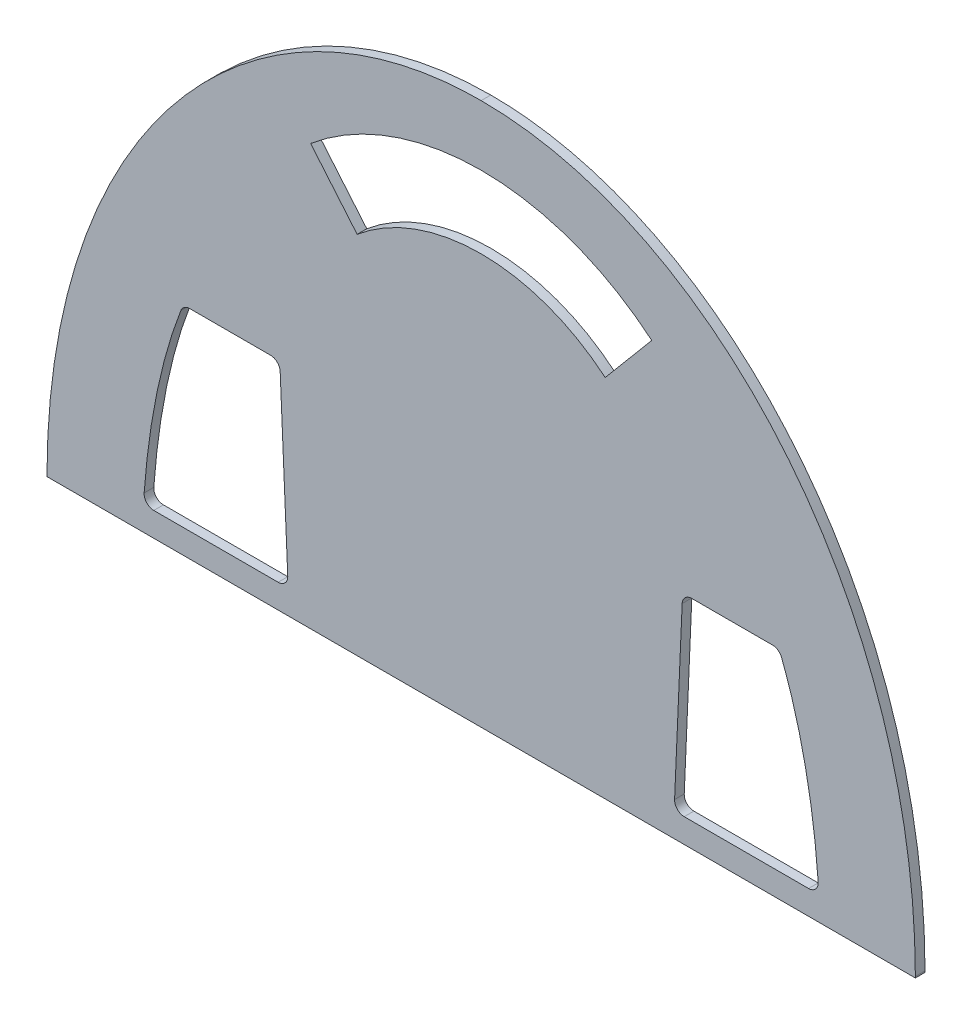
ISO-10303-21;
HEADER;
FILE_DESCRIPTION(('STEP AP214'),'2;1');
FILE_NAME('part.step','',(''),(''),'','','');
FILE_SCHEMA(('AUTOMOTIVE_DESIGN { 1 0 10303 214 1 1 1 1 }'));
ENDSEC;
DATA;
#1=APPLICATION_CONTEXT('core data for automotive mechanical design processes');
#2=APPLICATION_PROTOCOL_DEFINITION('international standard','automotive_design',2000,#1);
#3=PRODUCT_CONTEXT('',#1,'mechanical');
#4=PRODUCT('Part','Part','',(#3));
#5=PRODUCT_RELATED_PRODUCT_CATEGORY('part','',(#4));
#6=PRODUCT_DEFINITION_FORMATION('','',#4);
#7=PRODUCT_DEFINITION_CONTEXT('part definition',#1,'design');
#8=PRODUCT_DEFINITION('design','',#6,#7);
#9=PRODUCT_DEFINITION_SHAPE('','',#8);
#10=(LENGTH_UNIT() NAMED_UNIT(*) SI_UNIT(.MILLI.,.METRE.));
#11=(NAMED_UNIT(*) PLANE_ANGLE_UNIT() SI_UNIT($,.RADIAN.));
#12=(NAMED_UNIT(*) SI_UNIT($,.STERADIAN.) SOLID_ANGLE_UNIT());
#13=UNCERTAINTY_MEASURE_WITH_UNIT(LENGTH_MEASURE(1.E-05),#10,'distance_accuracy_value','');
#14=(GEOMETRIC_REPRESENTATION_CONTEXT(3) GLOBAL_UNCERTAINTY_ASSIGNED_CONTEXT((#13)) GLOBAL_UNIT_ASSIGNED_CONTEXT((#10,
#11,#12)) REPRESENTATION_CONTEXT('',''));
#15=CARTESIAN_POINT('',(0.,0.,0.));
#16=DIRECTION('',(0.,0.,1.));
#17=DIRECTION('',(1.,0.,0.));
#18=AXIS2_PLACEMENT_3D('',#15,#16,#17);
#19=CARTESIAN_POINT('',(-90.0000463433357,0.,2.));
#20=DIRECTION('',(0.999999985815437,-0.000168431370329986,0.));
#21=DIRECTION('',(0.000168431370329986,0.999999985815437,0.));
#22=AXIS2_PLACEMENT_3D('',#19,#20,#21);
#23=PLANE('',#22);
#24=DIRECTION('',(-0.000168431370329986,-0.999999985815437,0.));
#25=VECTOR('',#24,1.);
#26=CARTESIAN_POINT('',(-90.0000463433357,0.,0.));
#27=LINE('',#26,#25);
#28=CARTESIAN_POINT('',(-89.9999999998834,0.275147387972544,0.));
#29=VERTEX_POINT('',#28);
#30=CARTESIAN_POINT('',(-90.0000463433357,0.,0.));
#31=VERTEX_POINT('',#30);
#32=EDGE_CURVE('E332',#29,#31,#27,.T.);
#33=ORIENTED_EDGE('',*,*,#32,.T.);
#34=DIRECTION('',(0.,0.,-1.));
#35=VECTOR('',#34,1.);
#36=CARTESIAN_POINT('',(-90.0000463433357,0.,2.));
#37=LINE('',#36,#35);
#38=CARTESIAN_POINT('',(-90.0000463433357,0.,2.));
#39=VERTEX_POINT('',#38);
#40=EDGE_CURVE('E378',#39,#31,#37,.T.);
#41=ORIENTED_EDGE('',*,*,#40,.F.);
#42=DIRECTION('',(-0.000168431370329986,-0.999999985815437,0.));
#43=VECTOR('',#42,1.);
#44=CARTESIAN_POINT('',(-90.0000463433357,0.,2.));
#45=LINE('',#44,#43);
#46=CARTESIAN_POINT('',(-89.9999999998834,0.275147387972544,2.));
#47=VERTEX_POINT('',#46);
#48=EDGE_CURVE('E262',#47,#39,#45,.T.);
#49=ORIENTED_EDGE('',*,*,#48,.F.);
#50=DIRECTION('',(0.,0.,-1.));
#51=VECTOR('',#50,1.);
#52=CARTESIAN_POINT('',(-89.9999999998834,0.275147387972544,2.));
#53=LINE('',#52,#51);
#54=EDGE_CURVE('E368',#47,#29,#53,.T.);
#55=ORIENTED_EDGE('',*,*,#54,.T.);
#56=EDGE_LOOP('',(#33,#41,#49,#55));
#57=FACE_BOUND('',#56,.T.);
#58=ADVANCED_FACE('F51',(#57),#23,.F.);
#59=CARTESIAN_POINT('',(-90.0000463433357,0.,2.));
#60=DIRECTION('',(0.,1.,0.));
#61=DIRECTION('',(0.,0.,1.));
#62=AXIS2_PLACEMENT_3D('',#59,#60,#61);
#63=PLANE('',#62);
#64=DIRECTION('',(1.,0.,0.));
#65=VECTOR('',#64,1.);
#66=CARTESIAN_POINT('',(-90.0000463433357,0.,0.));
#67=LINE('',#66,#65);
#68=CARTESIAN_POINT('',(90.0000463433359,0.,0.));
#69=VERTEX_POINT('',#68);
#70=EDGE_CURVE('E344',#31,#69,#67,.T.);
#71=ORIENTED_EDGE('',*,*,#70,.T.);
#72=DIRECTION('',(0.,0.,-1.));
#73=VECTOR('',#72,1.);
#74=CARTESIAN_POINT('',(90.0000463433359,0.,2.));
#75=LINE('',#74,#73);
#76=CARTESIAN_POINT('',(90.0000463433359,0.,2.));
#77=VERTEX_POINT('',#76);
#78=EDGE_CURVE('E372',#77,#69,#75,.T.);
#79=ORIENTED_EDGE('',*,*,#78,.F.);
#80=DIRECTION('',(1.,0.,0.));
#81=VECTOR('',#80,1.);
#82=CARTESIAN_POINT('',(-90.0000463433357,0.,2.));
#83=LINE('',#82,#81);
#84=EDGE_CURVE('E256',#39,#77,#83,.T.);
#85=ORIENTED_EDGE('',*,*,#84,.F.);
#86=ORIENTED_EDGE('',*,*,#40,.T.);
#87=EDGE_LOOP('',(#71,#79,#85,#86));
#88=FACE_BOUND('',#87,.T.);
#89=ADVANCED_FACE('F416',(#88),#63,.F.);
#90=CARTESIAN_POINT('',(90.,0.275147387983933,2.));
#91=DIRECTION('',(-0.999999985815508,-0.000168430947403332,0.));
#92=DIRECTION('',(0.000168430947403332,-0.999999985815508,0.));
#93=AXIS2_PLACEMENT_3D('',#90,#91,#92);
#94=PLANE('',#93);
#95=DIRECTION('',(-0.000168430947403332,0.999999985815508,0.));
#96=VECTOR('',#95,1.);
#97=CARTESIAN_POINT('',(90.,0.275147387983933,0.));
#98=LINE('',#97,#96);
#99=CARTESIAN_POINT('',(90.,0.275147387983933,0.));
#100=VERTEX_POINT('',#99);
#101=EDGE_CURVE('E312',#69,#100,#98,.T.);
#102=ORIENTED_EDGE('',*,*,#101,.T.);
#103=DIRECTION('',(0.,0.,-1.));
#104=VECTOR('',#103,1.);
#105=CARTESIAN_POINT('',(90.,0.275147387983933,2.));
#106=LINE('',#105,#104);
#107=CARTESIAN_POINT('',(90.,0.275147387983933,2.));
#108=VERTEX_POINT('',#107);
#109=EDGE_CURVE('E359',#108,#100,#106,.T.);
#110=ORIENTED_EDGE('',*,*,#109,.F.);
#111=DIRECTION('',(-0.000168430947403332,0.999999985815508,0.));
#112=VECTOR('',#111,1.);
#113=CARTESIAN_POINT('',(90.,0.275147387983933,2.));
#114=LINE('',#113,#112);
#115=EDGE_CURVE('E265',#77,#108,#114,.T.);
#116=ORIENTED_EDGE('',*,*,#115,.F.);
#117=ORIENTED_EDGE('',*,*,#78,.T.);
#118=EDGE_LOOP('',(#102,#110,#116,#117));
#119=FACE_BOUND('',#118,.T.);
#120=ADVANCED_FACE('F285',(#119),#94,.F.);
#121=CARTESIAN_POINT('',(89.9999999998834,0.275147387972544,2.));
#122=CARTESIAN_POINT('',(89.8826957907706,65.7230552472039,2.));
#123=CARTESIAN_POINT('',(47.9199818309303,112.500308160194,2.));
#124=CARTESIAN_POINT('',(0.,112.500308160194,2.));
#125=B_SPLINE_CURVE_WITH_KNOTS('',3,(#121,#122,#123,#124),.UNSPECIFIED.,.F.,.F.,(4,4),
(0.0013988367909159,1.),.UNSPECIFIED.);
#126=DIRECTION('',(0.,0.,-1.));
#127=VECTOR('',#126,1.);
#128=SURFACE_OF_LINEAR_EXTRUSION('',#125,#127);
#129=CARTESIAN_POINT('',(89.9999999998834,0.275147387972544,0.));
#130=CARTESIAN_POINT('',(89.8826957907706,65.7230552472039,0.));
#131=CARTESIAN_POINT('',(47.9199818309303,112.500308160194,0.));
#132=CARTESIAN_POINT('',(0.,112.500308160194,0.));
#133=B_SPLINE_CURVE_WITH_KNOTS('',3,(#129,#130,#131,#132),.UNSPECIFIED.,.F.,.F.,(4,4),
(0.0013988367909159,1.),.UNSPECIFIED.);
#134=CARTESIAN_POINT('',(0.,112.500308160194,0.));
#135=VERTEX_POINT('',#134);
#136=EDGE_CURVE('E307',#100,#135,#133,.T.);
#137=ORIENTED_EDGE('',*,*,#136,.T.);
#138=DIRECTION('',(0.,0.,-1.));
#139=VECTOR('',#138,1.);
#140=CARTESIAN_POINT('',(0.,112.500308160194,2.));
#141=LINE('',#140,#139);
#142=CARTESIAN_POINT('',(0.,112.500308160194,2.));
#143=VERTEX_POINT('',#142);
#144=EDGE_CURVE('E365',#143,#135,#141,.T.);
#145=ORIENTED_EDGE('',*,*,#144,.F.);
#146=CARTESIAN_POINT('',(0.,112.500308160194,2.));
#147=CARTESIAN_POINT('',(47.9199818309303,112.500308160194,2.));
#148=CARTESIAN_POINT('',(89.8826957907706,65.7230552472039,2.));
#149=CARTESIAN_POINT('',(89.9999999998834,0.275147387972544,2.));
#150=B_SPLINE_CURVE_WITH_KNOTS('',3,(#146,#147,#148,#149),.UNSPECIFIED.,.F.,.F.,(4,4),
(0.0013988367909159,1.),.UNSPECIFIED.);
#151=EDGE_CURVE('E348',#108,#143,#150,.F.);
#152=ORIENTED_EDGE('',*,*,#151,.F.);
#153=ORIENTED_EDGE('',*,*,#109,.T.);
#154=EDGE_LOOP('',(#137,#145,#152,#153));
#155=FACE_BOUND('',#154,.T.);
#156=ADVANCED_FACE('F277',(#155),#128,.F.);
#157=CARTESIAN_POINT('',(0.,112.500308160194,2.));
#158=CARTESIAN_POINT('',(-47.9199818309303,112.500308160194,2.));
#159=CARTESIAN_POINT('',(-89.8826957907706,65.7230552472039,2.));
#160=CARTESIAN_POINT('',(-89.9999999998834,0.275147387972544,2.));
#161=B_SPLINE_CURVE_WITH_KNOTS('',3,(#157,#158,#159,#160),.UNSPECIFIED.,.F.,.F.,(4,4),
(0.0013988367909159,1.),.UNSPECIFIED.);
#162=DIRECTION('',(0.,0.,-1.));
#163=VECTOR('',#162,1.);
#164=SURFACE_OF_LINEAR_EXTRUSION('',#161,#163);
#165=CARTESIAN_POINT('',(0.,112.500308160194,0.));
#166=CARTESIAN_POINT('',(-47.9199818309303,112.500308160194,0.));
#167=CARTESIAN_POINT('',(-89.8826957907706,65.7230552472039,0.));
#168=CARTESIAN_POINT('',(-89.9999999998834,0.275147387972544,0.));
#169=B_SPLINE_CURVE_WITH_KNOTS('',3,(#165,#166,#167,#168),.UNSPECIFIED.,.F.,.F.,(4,4),
(0.0013988367909159,1.),.UNSPECIFIED.);
#170=EDGE_CURVE('E396',#135,#29,#169,.T.);
#171=ORIENTED_EDGE('',*,*,#170,.T.);
#172=ORIENTED_EDGE('',*,*,#54,.F.);
#173=CARTESIAN_POINT('',(-89.9999999998834,0.275147387972544,2.));
#174=CARTESIAN_POINT('',(-89.8826957907706,65.7230552472039,2.));
#175=CARTESIAN_POINT('',(-47.9199818309303,112.500308160194,2.));
#176=CARTESIAN_POINT('',(0.,112.500308160194,2.));
#177=B_SPLINE_CURVE_WITH_KNOTS('',3,(#173,#174,#175,#176),.UNSPECIFIED.,.F.,.F.,(4,4),
(0.0013988367909159,1.),.UNSPECIFIED.);
#178=EDGE_CURVE('E362',#143,#47,#177,.F.);
#179=ORIENTED_EDGE('',*,*,#178,.F.);
#180=ORIENTED_EDGE('',*,*,#144,.T.);
#181=EDGE_LOOP('',(#171,#172,#179,#180));
#182=FACE_BOUND('',#181,.T.);
#183=ADVANCED_FACE('F281',(#182),#164,.F.);
#184=CARTESIAN_POINT('',(-62.9260041081232,80.9306932212949,2.));
#185=DIRECTION('',(0.,0.,-1.));
#186=DIRECTION('',(-1.,0.,0.));
#187=AXIS2_PLACEMENT_3D('',#184,#185,#186);
#188=PLANE('',#187);
#189=DIRECTION('',(1.,0.,0.));
#190=VECTOR('',#189,1.);
#191=CARTESIAN_POINT('',(-70.,5.,2.));
#192=LINE('',#191,#190);
#193=CARTESIAN_POINT('',(-67.8634780766732,5.,2.));
#194=VERTEX_POINT('',#193);
#195=CARTESIAN_POINT('',(-42.0892272561437,5.,2.));
#196=VERTEX_POINT('',#195);
#197=EDGE_CURVE('E443',#194,#196,#192,.T.);
#198=ORIENTED_EDGE('',*,*,#197,.F.);
#199=CARTESIAN_POINT('',(-67.8634780766732,6.99999999999999,2.));
#200=DIRECTION('',(0.,0.,-1.));
#201=DIRECTION('',(-1.,0.,0.));
#202=AXIS2_PLACEMENT_3D('',#199,#200,#201);
#203=CIRCLE('',#202,2.);
#204=CARTESIAN_POINT('',(-69.8582176423669,7.14496228839299,2.));
#205=VERTEX_POINT('',#204);
#206=EDGE_CURVE('E58',#194,#205,#203,.T.);
#207=ORIENTED_EDGE('',*,*,#206,.T.);
#208=CARTESIAN_POINT('',(-39.5633905709148,-5.,2.));
#209=DIRECTION('',(0.,0.,1.));
#210=DIRECTION('',(0.,1.,0.));
#211=AXIS2_PLACEMENT_3D('',#208,#209,#210);
#212=ELLIPSE('',#211,72.1828157906234,30.7329599658152);
#213=CARTESIAN_POINT('',(-62.2528933539791,43.6869712921857,2.));
#214=VERTEX_POINT('',#213);
#215=EDGE_CURVE('E450',#214,#205,#212,.T.);
#216=ORIENTED_EDGE('',*,*,#215,.F.);
#217=CARTESIAN_POINT('',(-60.3889423148479,42.9619288632743,2.));
#218=DIRECTION('',(0.,0.,-1.));
#219=DIRECTION('',(-1.,0.,0.));
#220=AXIS2_PLACEMENT_3D('',#217,#218,#219);
#221=CIRCLE('',#220,2.);
#222=CARTESIAN_POINT('',(-60.3889423148479,44.9619288632743,2.));
#223=VERTEX_POINT('',#222);
#224=EDGE_CURVE('E563',#214,#223,#221,.T.);
#225=ORIENTED_EDGE('',*,*,#224,.T.);
#226=DIRECTION('',(-1.,0.,0.));
#227=VECTOR('',#226,1.);
#228=CARTESIAN_POINT('',(-41.7447754946136,44.9619288632743,2.));
#229=LINE('',#228,#227);
#230=CARTESIAN_POINT('',(-43.6593589791232,44.9619288632743,2.));
#231=VERTEX_POINT('',#230);
#232=EDGE_CURVE('E341',#231,#223,#229,.T.);
#233=ORIENTED_EDGE('',*,*,#232,.F.);
#234=CARTESIAN_POINT('',(-43.6593589791232,42.9619288632743,2.));
#235=DIRECTION('',(0.,0.,-1.));
#236=DIRECTION('',(-1.,0.,0.));
#237=AXIS2_PLACEMENT_3D('',#234,#235,#236);
#238=CIRCLE('',#237,2.);
#239=CARTESIAN_POINT('',(-41.6612625359595,43.049167638005,2.));
#240=VERTEX_POINT('',#239);
#241=EDGE_CURVE('E560',#231,#240,#238,.T.);
#242=ORIENTED_EDGE('',*,*,#241,.T.);
#243=DIRECTION('',(-0.0436193873653399,0.999048221581858,0.));
#244=VECTOR('',#243,1.);
#245=CARTESIAN_POINT('',(-40.,5.,2.));
#246=LINE('',#245,#244);
#247=CARTESIAN_POINT('',(-40.09113081298,7.08723877473068,2.));
#248=VERTEX_POINT('',#247);
#249=EDGE_CURVE('E439',#248,#240,#246,.T.);
#250=ORIENTED_EDGE('',*,*,#249,.F.);
#251=CARTESIAN_POINT('',(-42.0892272561437,7.,2.));
#252=DIRECTION('',(0.,0.,-1.));
#253=DIRECTION('',(-1.,0.,0.));
#254=AXIS2_PLACEMENT_3D('',#251,#252,#253);
#255=CIRCLE('',#254,2.);
#256=EDGE_CURVE('E70',#248,#196,#255,.T.);
#257=ORIENTED_EDGE('',*,*,#256,.T.);
#258=EDGE_LOOP('',(#198,#207,#216,#225,#233,#242,#250,#257));
#259=FACE_BOUND('',#258,.T.);
#260=DIRECTION('',(-1.,0.,0.));
#261=VECTOR('',#260,1.);
#262=CARTESIAN_POINT('',(41.744775494613,44.9619288632749,2.));
#263=LINE('',#262,#261);
#264=CARTESIAN_POINT('',(60.3889423148473,44.9619288632751,2.));
#265=VERTEX_POINT('',#264);
#266=CARTESIAN_POINT('',(43.6593589791226,44.9619288632749,2.));
#267=VERTEX_POINT('',#266);
#268=EDGE_CURVE('E453',#265,#267,#263,.T.);
#269=ORIENTED_EDGE('',*,*,#268,.F.);
#270=CARTESIAN_POINT('',(60.3889423148473,42.9619288632751,2.));
#271=DIRECTION('',(0.,0.,-1.));
#272=DIRECTION('',(-1.,0.,0.));
#273=AXIS2_PLACEMENT_3D('',#270,#271,#272);
#274=CIRCLE('',#273,2.);
#275=CARTESIAN_POINT('',(62.2528933539785,43.6869712921865,2.));
#276=VERTEX_POINT('',#275);
#277=EDGE_CURVE('E582',#265,#276,#274,.T.);
#278=ORIENTED_EDGE('',*,*,#277,.T.);
#279=CARTESIAN_POINT('',(39.5633905709149,-4.99999999999946,2.));
#280=DIRECTION('',(0.,0.,1.));
#281=DIRECTION('',(0.,1.,0.));
#282=AXIS2_PLACEMENT_3D('',#279,#280,#281);
#283=ELLIPSE('',#282,72.1828157906234,30.7329599658152);
#284=CARTESIAN_POINT('',(69.8582176423668,7.14496228839395,2.));
#285=VERTEX_POINT('',#284);
#286=EDGE_CURVE('E452',#285,#276,#283,.T.);
#287=ORIENTED_EDGE('',*,*,#286,.F.);
#288=CARTESIAN_POINT('',(67.8634780766731,7.00000000000092,2.));
#289=DIRECTION('',(0.,0.,-1.));
#290=DIRECTION('',(-1.,0.,0.));
#291=AXIS2_PLACEMENT_3D('',#288,#289,#290);
#292=CIRCLE('',#291,2.);
#293=CARTESIAN_POINT('',(67.8634780766731,5.00000000000092,2.));
#294=VERTEX_POINT('',#293);
#295=EDGE_CURVE('E590',#285,#294,#292,.T.);
#296=ORIENTED_EDGE('',*,*,#295,.T.);
#297=DIRECTION('',(1.,0.,0.));
#298=VECTOR('',#297,1.);
#299=CARTESIAN_POINT('',(70.,5.00000000000095,2.));
#300=LINE('',#299,#298);
#301=CARTESIAN_POINT('',(42.0892272561436,5.00000000000057,2.));
#302=VERTEX_POINT('',#301);
#303=EDGE_CURVE('E248',#302,#294,#300,.T.);
#304=ORIENTED_EDGE('',*,*,#303,.F.);
#305=CARTESIAN_POINT('',(42.0892272561436,7.00000000000057,2.));
#306=DIRECTION('',(0.,0.,-1.));
#307=DIRECTION('',(-1.,0.,0.));
#308=AXIS2_PLACEMENT_3D('',#305,#306,#307);
#309=CIRCLE('',#308,2.);
#310=CARTESIAN_POINT('',(40.0911308129799,7.08723877473122,2.));
#311=VERTEX_POINT('',#310);
#312=EDGE_CURVE('E567',#302,#311,#309,.T.);
#313=ORIENTED_EDGE('',*,*,#312,.T.);
#314=DIRECTION('',(-0.0436193873653264,-0.999048221581858,0.));
#315=VECTOR('',#314,1.);
#316=CARTESIAN_POINT('',(39.9999999999999,5.00000000000054,2.));
#317=LINE('',#316,#315);
#318=CARTESIAN_POINT('',(41.6612625359589,43.0491676380055,2.));
#319=VERTEX_POINT('',#318);
#320=EDGE_CURVE('E251',#319,#311,#317,.T.);
#321=ORIENTED_EDGE('',*,*,#320,.F.);
#322=CARTESIAN_POINT('',(43.6593589791226,42.9619288632749,2.));
#323=DIRECTION('',(0.,0.,-1.));
#324=DIRECTION('',(-1.,0.,0.));
#325=AXIS2_PLACEMENT_3D('',#322,#323,#324);
#326=CIRCLE('',#325,2.);
#327=EDGE_CURVE('E574',#319,#267,#326,.T.);
#328=ORIENTED_EDGE('',*,*,#327,.T.);
#329=EDGE_LOOP('',(#269,#278,#287,#296,#304,#313,#321,#328));
#330=FACE_BOUND('',#329,.T.);
#331=DIRECTION('',(0.64278760968654,-0.766044443118977,0.));
#332=VECTOR('',#331,1.);
#333=CARTESIAN_POINT('',(-35.3533185327597,87.1324443715437,2.));
#334=LINE('',#333,#332);
#335=CARTESIAN_POINT('',(-35.3533185327597,87.1324443715437,2.));
#336=VERTEX_POINT('',#335);
#337=CARTESIAN_POINT('',(-25.7115043874616,75.6417777247591,2.));
#338=VERTEX_POINT('',#337);
#339=EDGE_CURVE('E250',#336,#338,#334,.T.);
#340=ORIENTED_EDGE('',*,*,#339,.F.);
#341=CARTESIAN_POINT('',(0.,45.,2.));
#342=DIRECTION('',(0.,0.,1.));
#343=DIRECTION('',(-1.,0.,0.));
#344=AXIS2_PLACEMENT_3D('',#341,#342,#343);
#345=CIRCLE('',#344,55.);
#346=CARTESIAN_POINT('',(35.3533185327597,87.1324443715437,2.));
#347=VERTEX_POINT('',#346);
#348=EDGE_CURVE('E221',#347,#336,#345,.T.);
#349=ORIENTED_EDGE('',*,*,#348,.F.);
#350=DIRECTION('',(0.64278760968654,0.766044443118977,0.));
#351=VECTOR('',#350,1.);
#352=CARTESIAN_POINT('',(35.3533185327597,87.1324443715437,2.));
#353=LINE('',#352,#351);
#354=CARTESIAN_POINT('',(25.7115043874616,75.6417777247591,2.));
#355=VERTEX_POINT('',#354);
#356=EDGE_CURVE('E231',#355,#347,#353,.T.);
#357=ORIENTED_EDGE('',*,*,#356,.F.);
#358=CARTESIAN_POINT('',(0.,45.,2.));
#359=DIRECTION('',(0.,0.,-1.));
#360=DIRECTION('',(1.,0.,0.));
#361=AXIS2_PLACEMENT_3D('',#358,#359,#360);
#362=CIRCLE('',#361,40.);
#363=EDGE_CURVE('E239',#338,#355,#362,.T.);
#364=ORIENTED_EDGE('',*,*,#363,.F.);
#365=EDGE_LOOP('',(#340,#349,#357,#364));
#366=FACE_BOUND('',#365,.T.);
#367=ORIENTED_EDGE('',*,*,#48,.T.);
#368=ORIENTED_EDGE('',*,*,#84,.T.);
#369=ORIENTED_EDGE('',*,*,#115,.T.);
#370=ORIENTED_EDGE('',*,*,#151,.T.);
#371=ORIENTED_EDGE('',*,*,#178,.T.);
#372=EDGE_LOOP('',(#367,#368,#369,#370,#371));
#373=FACE_BOUND('',#372,.T.);
#374=ADVANCED_FACE('F242',(#259,#330,#366,#373),#188,.F.);
#375=CARTESIAN_POINT('',(-62.9260041081232,80.9306932212949,0.));
#376=DIRECTION('',(0.,0.,-1.));
#377=DIRECTION('',(-1.,0.,0.));
#378=AXIS2_PLACEMENT_3D('',#375,#376,#377);
#379=PLANE('',#378);
#380=CARTESIAN_POINT('',(-39.5633905709148,-5.,0.));
#381=DIRECTION('',(0.,0.,1.));
#382=DIRECTION('',(0.,1.,0.));
#383=AXIS2_PLACEMENT_3D('',#380,#381,#382);
#384=ELLIPSE('',#383,72.1828157906234,30.7329599658152);
#385=CARTESIAN_POINT('',(-69.8582176423669,7.14496228839299,0.));
#386=VERTEX_POINT('',#385);
#387=CARTESIAN_POINT('',(-62.2528933539791,43.6869712921857,0.));
#388=VERTEX_POINT('',#387);
#389=EDGE_CURVE('E642',#386,#388,#384,.F.);
#390=ORIENTED_EDGE('',*,*,#389,.F.);
#391=CARTESIAN_POINT('',(-67.8634780766732,6.99999999999999,0.));
#392=DIRECTION('',(0.,0.,-1.));
#393=DIRECTION('',(-1.,0.,0.));
#394=AXIS2_PLACEMENT_3D('',#391,#392,#393);
#395=CIRCLE('',#394,2.);
#396=CARTESIAN_POINT('',(-67.8634780766732,5.,0.));
#397=VERTEX_POINT('',#396);
#398=EDGE_CURVE('E11',#386,#397,#395,.F.);
#399=ORIENTED_EDGE('',*,*,#398,.T.);
#400=DIRECTION('',(-1.,0.,0.));
#401=VECTOR('',#400,1.);
#402=CARTESIAN_POINT('',(-62.9260041081232,5.,0.));
#403=LINE('',#402,#401);
#404=CARTESIAN_POINT('',(-42.0892272561437,5.,0.));
#405=VERTEX_POINT('',#404);
#406=EDGE_CURVE('E655',#405,#397,#403,.T.);
#407=ORIENTED_EDGE('',*,*,#406,.F.);
#408=CARTESIAN_POINT('',(-42.0892272561437,7.,0.));
#409=DIRECTION('',(0.,0.,-1.));
#410=DIRECTION('',(-1.,0.,0.));
#411=AXIS2_PLACEMENT_3D('',#408,#409,#410);
#412=CIRCLE('',#411,2.);
#413=CARTESIAN_POINT('',(-40.09113081298,7.08723877473068,0.));
#414=VERTEX_POINT('',#413);
#415=EDGE_CURVE('E541',#405,#414,#412,.F.);
#416=ORIENTED_EDGE('',*,*,#415,.T.);
#417=DIRECTION('',(0.0436193873653399,-0.999048221581858,0.));
#418=VECTOR('',#417,1.);
#419=CARTESIAN_POINT('',(-43.3525181661142,81.7852900735296,0.));
#420=LINE('',#419,#418);
#421=CARTESIAN_POINT('',(-41.6612625359595,43.049167638005,0.));
#422=VERTEX_POINT('',#421);
#423=EDGE_CURVE('E646',#422,#414,#420,.T.);
#424=ORIENTED_EDGE('',*,*,#423,.F.);
#425=CARTESIAN_POINT('',(-43.6593589791232,42.9619288632743,0.));
#426=DIRECTION('',(0.,0.,-1.));
#427=DIRECTION('',(-1.,0.,0.));
#428=AXIS2_PLACEMENT_3D('',#425,#426,#427);
#429=CIRCLE('',#428,2.);
#430=CARTESIAN_POINT('',(-43.6593589791232,44.9619288632743,0.));
#431=VERTEX_POINT('',#430);
#432=EDGE_CURVE('E552',#422,#431,#429,.F.);
#433=ORIENTED_EDGE('',*,*,#432,.T.);
#434=DIRECTION('',(1.,0.,0.));
#435=VECTOR('',#434,1.);
#436=CARTESIAN_POINT('',(-62.9260041081232,44.9619288632743,0.));
#437=LINE('',#436,#435);
#438=CARTESIAN_POINT('',(-60.3889423148479,44.9619288632743,0.));
#439=VERTEX_POINT('',#438);
#440=EDGE_CURVE('E643',#439,#431,#437,.T.);
#441=ORIENTED_EDGE('',*,*,#440,.F.);
#442=CARTESIAN_POINT('',(-60.3889423148479,42.9619288632743,0.));
#443=DIRECTION('',(0.,0.,-1.));
#444=DIRECTION('',(-1.,0.,0.));
#445=AXIS2_PLACEMENT_3D('',#442,#443,#444);
#446=CIRCLE('',#445,2.);
#447=EDGE_CURVE('E557',#439,#388,#446,.F.);
#448=ORIENTED_EDGE('',*,*,#447,.T.);
#449=EDGE_LOOP('',(#390,#399,#407,#416,#424,#433,#441,#448));
#450=FACE_BOUND('',#449,.T.);
#451=CARTESIAN_POINT('',(39.5633905709149,-4.99999999999946,0.));
#452=DIRECTION('',(0.,0.,1.));
#453=DIRECTION('',(0.,1.,0.));
#454=AXIS2_PLACEMENT_3D('',#451,#452,#453);
#455=ELLIPSE('',#454,72.1828157906234,30.7329599658152);
#456=CARTESIAN_POINT('',(62.2528933539785,43.6869712921865,0.));
#457=VERTEX_POINT('',#456);
#458=CARTESIAN_POINT('',(69.8582176423668,7.14496228839395,0.));
#459=VERTEX_POINT('',#458);
#460=EDGE_CURVE('E658',#457,#459,#455,.F.);
#461=ORIENTED_EDGE('',*,*,#460,.F.);
#462=CARTESIAN_POINT('',(60.3889423148473,42.9619288632751,0.));
#463=DIRECTION('',(0.,0.,-1.));
#464=DIRECTION('',(-1.,0.,0.));
#465=AXIS2_PLACEMENT_3D('',#462,#463,#464);
#466=CIRCLE('',#465,2.);
#467=CARTESIAN_POINT('',(60.3889423148473,44.9619288632751,0.));
#468=VERTEX_POINT('',#467);
#469=EDGE_CURVE('E579',#457,#468,#466,.F.);
#470=ORIENTED_EDGE('',*,*,#469,.T.);
#471=DIRECTION('',(1.,0.,0.));
#472=VECTOR('',#471,1.);
#473=CARTESIAN_POINT('',(-62.9260041081228,44.9619288632735,0.));
#474=LINE('',#473,#472);
#475=CARTESIAN_POINT('',(43.6593589791226,44.9619288632749,0.));
#476=VERTEX_POINT('',#475);
#477=EDGE_CURVE('E669',#476,#468,#474,.T.);
#478=ORIENTED_EDGE('',*,*,#477,.F.);
#479=CARTESIAN_POINT('',(43.6593589791226,42.9619288632749,0.));
#480=DIRECTION('',(0.,0.,-1.));
#481=DIRECTION('',(-1.,0.,0.));
#482=AXIS2_PLACEMENT_3D('',#479,#480,#481);
#483=CIRCLE('',#482,2.);
#484=CARTESIAN_POINT('',(41.6612625359589,43.0491676380055,0.));
#485=VERTEX_POINT('',#484);
#486=EDGE_CURVE('E575',#476,#485,#483,.F.);
#487=ORIENTED_EDGE('',*,*,#486,.T.);
#488=DIRECTION('',(0.0436193873653264,0.999048221581858,0.));
#489=VECTOR('',#488,1.);
#490=CARTESIAN_POINT('',(43.1130657226017,76.3009274473449,0.));
#491=LINE('',#490,#489);
#492=CARTESIAN_POINT('',(40.0911308129798,7.08723877473121,0.));
#493=VERTEX_POINT('',#492);
#494=EDGE_CURVE('E664',#493,#485,#491,.T.);
#495=ORIENTED_EDGE('',*,*,#494,.F.);
#496=CARTESIAN_POINT('',(42.0892272561436,7.00000000000057,0.));
#497=DIRECTION('',(0.,0.,-1.));
#498=DIRECTION('',(-1.,0.,0.));
#499=AXIS2_PLACEMENT_3D('',#496,#497,#498);
#500=CIRCLE('',#499,2.);
#501=CARTESIAN_POINT('',(42.0892272561436,5.00000000000056,0.));
#502=VERTEX_POINT('',#501);
#503=EDGE_CURVE('E566',#493,#502,#500,.F.);
#504=ORIENTED_EDGE('',*,*,#503,.T.);
#505=DIRECTION('',(-1.,0.,0.));
#506=VECTOR('',#505,1.);
#507=CARTESIAN_POINT('',(-62.9260041081222,4.99999999999914,0.));
#508=LINE('',#507,#506);
#509=CARTESIAN_POINT('',(67.8634780766731,5.00000000000091,0.));
#510=VERTEX_POINT('',#509);
#511=EDGE_CURVE('E659',#510,#502,#508,.T.);
#512=ORIENTED_EDGE('',*,*,#511,.F.);
#513=CARTESIAN_POINT('',(67.8634780766731,7.00000000000092,0.));
#514=DIRECTION('',(0.,0.,-1.));
#515=DIRECTION('',(-1.,0.,0.));
#516=AXIS2_PLACEMENT_3D('',#513,#514,#515);
#517=CIRCLE('',#516,2.);
#518=EDGE_CURVE('E581',#510,#459,#517,.F.);
#519=ORIENTED_EDGE('',*,*,#518,.T.);
#520=EDGE_LOOP('',(#461,#470,#478,#487,#495,#504,#512,#519));
#521=FACE_BOUND('',#520,.T.);
#522=CARTESIAN_POINT('',(0.,45.,0.));
#523=DIRECTION('',(0.,0.,-1.));
#524=DIRECTION('',(-1.,0.,0.));
#525=AXIS2_PLACEMENT_3D('',#522,#523,#524);
#526=CIRCLE('',#525,55.);
#527=CARTESIAN_POINT('',(-35.3533185327597,87.1324443715437,0.));
#528=VERTEX_POINT('',#527);
#529=CARTESIAN_POINT('',(35.3533185327597,87.1324443715437,0.));
#530=VERTEX_POINT('',#529);
#531=EDGE_CURVE('E228',#528,#530,#526,.T.);
#532=ORIENTED_EDGE('',*,*,#531,.F.);
#533=DIRECTION('',(-0.64278760968654,0.766044443118977,0.));
#534=VECTOR('',#533,1.);
#535=CARTESIAN_POINT('',(-43.6919217111602,97.07000466662,0.));
#536=LINE('',#535,#534);
#537=CARTESIAN_POINT('',(-25.7115043874616,75.6417777247591,0.));
#538=VERTEX_POINT('',#537);
#539=EDGE_CURVE('E419',#538,#528,#536,.T.);
#540=ORIENTED_EDGE('',*,*,#539,.F.);
#541=CARTESIAN_POINT('',(0.,45.,0.));
#542=DIRECTION('',(0.,0.,-1.));
#543=DIRECTION('',(-1.,0.,0.));
#544=AXIS2_PLACEMENT_3D('',#541,#542,#543);
#545=CIRCLE('',#544,40.);
#546=CARTESIAN_POINT('',(25.7115043874616,75.6417777247591,0.));
#547=VERTEX_POINT('',#546);
#548=EDGE_CURVE('E421',#547,#538,#545,.F.);
#549=ORIENTED_EDGE('',*,*,#548,.F.);
#550=DIRECTION('',(-0.64278760968654,-0.766044443118977,0.));
#551=VECTOR('',#550,1.);
#552=CARTESIAN_POINT('',(-8.30709645572577,35.0999879548622,0.));
#553=LINE('',#552,#551);
#554=EDGE_CURVE('E673',#530,#547,#553,.T.);
#555=ORIENTED_EDGE('',*,*,#554,.F.);
#556=EDGE_LOOP('',(#532,#540,#549,#555));
#557=FACE_BOUND('',#556,.T.);
#558=ORIENTED_EDGE('',*,*,#32,.F.);
#559=ORIENTED_EDGE('',*,*,#170,.F.);
#560=ORIENTED_EDGE('',*,*,#136,.F.);
#561=ORIENTED_EDGE('',*,*,#101,.F.);
#562=ORIENTED_EDGE('',*,*,#70,.F.);
#563=EDGE_LOOP('',(#558,#559,#560,#561,#562));
#564=FACE_BOUND('',#563,.T.);
#565=ADVANCED_FACE('F314',(#450,#521,#557,#564),#379,.T.);
#566=CARTESIAN_POINT('',(0.,45.,-0.01));
#567=DIRECTION('',(0.,0.,1.));
#568=DIRECTION('',(1.,0.,0.));
#569=AXIS2_PLACEMENT_3D('',#566,#567,#568);
#570=CYLINDRICAL_SURFACE('',#569,55.);
#571=ORIENTED_EDGE('',*,*,#531,.T.);
#572=DIRECTION('',(0.,0.,1.));
#573=VECTOR('',#572,1.);
#574=CARTESIAN_POINT('',(35.3533185327597,87.1324443715437,-0.01));
#575=LINE('',#574,#573);
#576=EDGE_CURVE('E217',#530,#347,#575,.T.);
#577=ORIENTED_EDGE('',*,*,#576,.T.);
#578=ORIENTED_EDGE('',*,*,#348,.T.);
#579=DIRECTION('',(0.,0.,1.));
#580=VECTOR('',#579,1.);
#581=CARTESIAN_POINT('',(-35.3533185327597,87.1324443715437,-0.01));
#582=LINE('',#581,#580);
#583=EDGE_CURVE('E241',#528,#336,#582,.T.);
#584=ORIENTED_EDGE('',*,*,#583,.F.);
#585=EDGE_LOOP('',(#571,#577,#578,#584));
#586=FACE_BOUND('',#585,.T.);
#587=ADVANCED_FACE('F219',(#586),#570,.F.);
#588=CARTESIAN_POINT('',(35.3533185327597,87.1324443715437,-0.01));
#589=DIRECTION('',(0.766044443118977,-0.64278760968654,0.));
#590=DIRECTION('',(0.64278760968654,0.766044443118977,0.));
#591=AXIS2_PLACEMENT_3D('',#588,#589,#590);
#592=PLANE('',#591);
#593=ORIENTED_EDGE('',*,*,#554,.T.);
#594=DIRECTION('',(0.,0.,1.));
#595=VECTOR('',#594,1.);
#596=CARTESIAN_POINT('',(25.7115043874616,75.6417777247591,-0.01));
#597=LINE('',#596,#595);
#598=EDGE_CURVE('E229',#547,#355,#597,.T.);
#599=ORIENTED_EDGE('',*,*,#598,.T.);
#600=ORIENTED_EDGE('',*,*,#356,.T.);
#601=ORIENTED_EDGE('',*,*,#576,.F.);
#602=EDGE_LOOP('',(#593,#599,#600,#601));
#603=FACE_BOUND('',#602,.T.);
#604=ADVANCED_FACE('F234',(#603),#592,.F.);
#605=CARTESIAN_POINT('',(0.,45.,-0.01));
#606=DIRECTION('',(0.,0.,1.));
#607=DIRECTION('',(1.,0.,0.));
#608=AXIS2_PLACEMENT_3D('',#605,#606,#607);
#609=CYLINDRICAL_SURFACE('',#608,40.);
#610=ORIENTED_EDGE('',*,*,#548,.T.);
#611=DIRECTION('',(0.,0.,1.));
#612=VECTOR('',#611,1.);
#613=CARTESIAN_POINT('',(-25.7115043874616,75.6417777247591,-0.01));
#614=LINE('',#613,#612);
#615=EDGE_CURVE('E682',#538,#338,#614,.T.);
#616=ORIENTED_EDGE('',*,*,#615,.T.);
#617=ORIENTED_EDGE('',*,*,#363,.T.);
#618=ORIENTED_EDGE('',*,*,#598,.F.);
#619=EDGE_LOOP('',(#610,#616,#617,#618));
#620=FACE_BOUND('',#619,.T.);
#621=ADVANCED_FACE('F492',(#620),#609,.T.);
#622=CARTESIAN_POINT('',(-35.3533185327597,87.1324443715437,-0.01));
#623=DIRECTION('',(-0.766044443118977,-0.64278760968654,0.));
#624=DIRECTION('',(0.64278760968654,-0.766044443118977,0.));
#625=AXIS2_PLACEMENT_3D('',#622,#623,#624);
#626=PLANE('',#625);
#627=ORIENTED_EDGE('',*,*,#539,.T.);
#628=ORIENTED_EDGE('',*,*,#583,.T.);
#629=ORIENTED_EDGE('',*,*,#339,.T.);
#630=ORIENTED_EDGE('',*,*,#615,.F.);
#631=EDGE_LOOP('',(#627,#628,#629,#630));
#632=FACE_BOUND('',#631,.T.);
#633=ADVANCED_FACE('F476',(#632),#626,.F.);
#634=CARTESIAN_POINT('',(39.5633905709149,-4.99999999999946,-0.01));
#635=DIRECTION('',(0.,0.,1.));
#636=DIRECTION('',(0.,1.,0.));
#637=AXIS2_PLACEMENT_3D('',#634,#635,#636);
#638=ELLIPSE('',#637,72.1828157906234,30.7329599658152);
#639=DIRECTION('',(0.,0.,1.));
#640=VECTOR('',#639,1.);
#641=SURFACE_OF_LINEAR_EXTRUSION('',#638,#640);
#642=ORIENTED_EDGE('',*,*,#460,.T.);
#643=DIRECTION('',(0.,0.,1.));
#644=VECTOR('',#643,1.);
#645=CARTESIAN_POINT('',(69.8582176423668,7.14496228839395,0.));
#646=LINE('',#645,#644);
#647=EDGE_CURVE('E632',#459,#285,#646,.T.);
#648=ORIENTED_EDGE('',*,*,#647,.T.);
#649=ORIENTED_EDGE('',*,*,#286,.T.);
#650=DIRECTION('',(0.,0.,1.));
#651=VECTOR('',#650,1.);
#652=CARTESIAN_POINT('',(62.2528933539785,43.6869712921865,2.));
#653=LINE('',#652,#651);
#654=EDGE_CURVE('E637',#276,#457,#653,.F.);
#655=ORIENTED_EDGE('',*,*,#654,.T.);
#656=EDGE_LOOP('',(#642,#648,#649,#655));
#657=FACE_BOUND('',#656,.T.);
#658=ADVANCED_FACE('F472',(#657),#641,.F.);
#659=CARTESIAN_POINT('',(70.,5.00000000000095,-0.01));
#660=DIRECTION('',(0.,-1.,0.));
#661=DIRECTION('',(1.,0.,0.));
#662=AXIS2_PLACEMENT_3D('',#659,#660,#661);
#663=PLANE('',#662);
#664=ORIENTED_EDGE('',*,*,#303,.T.);
#665=DIRECTION('',(0.,0.,-1.));
#666=VECTOR('',#665,1.);
#667=CARTESIAN_POINT('',(67.8634780766731,5.00000000000092,0.));
#668=LINE('',#667,#666);
#669=EDGE_CURVE('E630',#294,#510,#668,.T.);
#670=ORIENTED_EDGE('',*,*,#669,.T.);
#671=ORIENTED_EDGE('',*,*,#511,.T.);
#672=DIRECTION('',(0.,0.,1.));
#673=VECTOR('',#672,1.);
#674=CARTESIAN_POINT('',(42.0892272561436,5.00000000000057,2.));
#675=LINE('',#674,#673);
#676=EDGE_CURVE('E629',#502,#302,#675,.T.);
#677=ORIENTED_EDGE('',*,*,#676,.T.);
#678=EDGE_LOOP('',(#664,#670,#671,#677));
#679=FACE_BOUND('',#678,.T.);
#680=ADVANCED_FACE('F473',(#679),#663,.F.);
#681=CARTESIAN_POINT('',(39.9999999999999,5.00000000000054,-0.01));
#682=DIRECTION('',(-0.999048221581858,0.0436193873653264,0.));
#683=DIRECTION('',(-0.0436193873653264,-0.999048221581858,0.));
#684=AXIS2_PLACEMENT_3D('',#681,#682,#683);
#685=PLANE('',#684);
#686=ORIENTED_EDGE('',*,*,#494,.T.);
#687=DIRECTION('',(0.,0.,1.));
#688=VECTOR('',#687,1.);
#689=CARTESIAN_POINT('',(41.6612625359589,43.0491676380055,2.));
#690=LINE('',#689,#688);
#691=EDGE_CURVE('E612',#485,#319,#690,.T.);
#692=ORIENTED_EDGE('',*,*,#691,.T.);
#693=ORIENTED_EDGE('',*,*,#320,.T.);
#694=DIRECTION('',(0.,0.,1.));
#695=VECTOR('',#694,1.);
#696=CARTESIAN_POINT('',(40.0911308129799,7.08723877473122,0.));
#697=LINE('',#696,#695);
#698=EDGE_CURVE('E617',#311,#493,#697,.F.);
#699=ORIENTED_EDGE('',*,*,#698,.T.);
#700=EDGE_LOOP('',(#686,#692,#693,#699));
#701=FACE_BOUND('',#700,.T.);
#702=ADVANCED_FACE('F482',(#701),#685,.F.);
#703=CARTESIAN_POINT('',(41.744775494613,44.9619288632749,-0.01));
#704=DIRECTION('',(0.,1.,0.));
#705=DIRECTION('',(-1.,0.,0.));
#706=AXIS2_PLACEMENT_3D('',#703,#704,#705);
#707=PLANE('',#706);
#708=ORIENTED_EDGE('',*,*,#477,.T.);
#709=DIRECTION('',(0.,0.,-1.));
#710=VECTOR('',#709,1.);
#711=CARTESIAN_POINT('',(60.3889423148473,44.9619288632751,2.));
#712=LINE('',#711,#710);
#713=EDGE_CURVE('E619',#468,#265,#712,.F.);
#714=ORIENTED_EDGE('',*,*,#713,.T.);
#715=ORIENTED_EDGE('',*,*,#268,.T.);
#716=DIRECTION('',(0.,0.,1.));
#717=VECTOR('',#716,1.);
#718=CARTESIAN_POINT('',(43.6593589791226,44.9619288632749,0.));
#719=LINE('',#718,#717);
#720=EDGE_CURVE('E624',#267,#476,#719,.F.);
#721=ORIENTED_EDGE('',*,*,#720,.T.);
#722=EDGE_LOOP('',(#708,#714,#715,#721));
#723=FACE_BOUND('',#722,.T.);
#724=ADVANCED_FACE('F483',(#723),#707,.F.);
#725=CARTESIAN_POINT('',(-39.5633905709148,-5.,-0.01));
#726=DIRECTION('',(0.,0.,1.));
#727=DIRECTION('',(0.,1.,0.));
#728=AXIS2_PLACEMENT_3D('',#725,#726,#727);
#729=ELLIPSE('',#728,72.1828157906234,30.7329599658152);
#730=DIRECTION('',(0.,0.,1.));
#731=VECTOR('',#730,1.);
#732=SURFACE_OF_LINEAR_EXTRUSION('',#729,#731);
#733=ORIENTED_EDGE('',*,*,#389,.T.);
#734=DIRECTION('',(0.,0.,1.));
#735=VECTOR('',#734,1.);
#736=CARTESIAN_POINT('',(-62.2528933539791,43.6869712921857,0.));
#737=LINE('',#736,#735);
#738=EDGE_CURVE('E610',#388,#214,#737,.T.);
#739=ORIENTED_EDGE('',*,*,#738,.T.);
#740=ORIENTED_EDGE('',*,*,#215,.T.);
#741=DIRECTION('',(0.,0.,1.));
#742=VECTOR('',#741,1.);
#743=CARTESIAN_POINT('',(-69.8582176423669,7.14496228839299,2.));
#744=LINE('',#743,#742);
#745=EDGE_CURVE('E613',#205,#386,#744,.F.);
#746=ORIENTED_EDGE('',*,*,#745,.T.);
#747=EDGE_LOOP('',(#733,#739,#740,#746));
#748=FACE_BOUND('',#747,.T.);
#749=ADVANCED_FACE('F477',(#748),#732,.F.);
#750=CARTESIAN_POINT('',(-41.7447754946136,44.9619288632743,-0.01));
#751=DIRECTION('',(0.,1.,0.));
#752=DIRECTION('',(0.,0.,1.));
#753=AXIS2_PLACEMENT_3D('',#750,#751,#752);
#754=PLANE('',#753);
#755=ORIENTED_EDGE('',*,*,#232,.T.);
#756=DIRECTION('',(0.,0.,-1.));
#757=VECTOR('',#756,1.);
#758=CARTESIAN_POINT('',(-60.3889423148479,44.9619288632743,0.));
#759=LINE('',#758,#757);
#760=EDGE_CURVE('E598',#223,#439,#759,.T.);
#761=ORIENTED_EDGE('',*,*,#760,.T.);
#762=ORIENTED_EDGE('',*,*,#440,.T.);
#763=DIRECTION('',(0.,0.,1.));
#764=VECTOR('',#763,1.);
#765=CARTESIAN_POINT('',(-43.6593589791232,44.9619288632743,2.));
#766=LINE('',#765,#764);
#767=EDGE_CURVE('E604',#431,#231,#766,.T.);
#768=ORIENTED_EDGE('',*,*,#767,.T.);
#769=EDGE_LOOP('',(#755,#761,#762,#768));
#770=FACE_BOUND('',#769,.T.);
#771=ADVANCED_FACE('F722',(#770),#754,.F.);
#772=CARTESIAN_POINT('',(-40.,5.,-0.01));
#773=DIRECTION('',(0.999048221581858,0.0436193873653399,0.));
#774=DIRECTION('',(-0.0436193873653399,0.999048221581858,0.));
#775=AXIS2_PLACEMENT_3D('',#772,#773,#774);
#776=PLANE('',#775);
#777=ORIENTED_EDGE('',*,*,#249,.T.);
#778=DIRECTION('',(0.,0.,1.));
#779=VECTOR('',#778,1.);
#780=CARTESIAN_POINT('',(-41.6612625359595,43.049167638005,0.));
#781=LINE('',#780,#779);
#782=EDGE_CURVE('E594',#240,#422,#781,.F.);
#783=ORIENTED_EDGE('',*,*,#782,.T.);
#784=ORIENTED_EDGE('',*,*,#423,.T.);
#785=DIRECTION('',(0.,0.,1.));
#786=VECTOR('',#785,1.);
#787=CARTESIAN_POINT('',(-40.09113081298,7.08723877473068,2.));
#788=LINE('',#787,#786);
#789=EDGE_CURVE('E543',#414,#248,#788,.T.);
#790=ORIENTED_EDGE('',*,*,#789,.T.);
#791=EDGE_LOOP('',(#777,#783,#784,#790));
#792=FACE_BOUND('',#791,.T.);
#793=ADVANCED_FACE('F729',(#792),#776,.F.);
#794=CARTESIAN_POINT('',(-70.,5.,-0.01));
#795=DIRECTION('',(0.,-1.,0.));
#796=DIRECTION('',(0.,0.,-1.));
#797=AXIS2_PLACEMENT_3D('',#794,#795,#796);
#798=PLANE('',#797);
#799=ORIENTED_EDGE('',*,*,#197,.T.);
#800=DIRECTION('',(0.,0.,1.));
#801=VECTOR('',#800,1.);
#802=CARTESIAN_POINT('',(-42.0892272561437,5.,0.));
#803=LINE('',#802,#801);
#804=EDGE_CURVE('E545',#196,#405,#803,.F.);
#805=ORIENTED_EDGE('',*,*,#804,.T.);
#806=ORIENTED_EDGE('',*,*,#406,.T.);
#807=DIRECTION('',(0.,0.,-1.));
#808=VECTOR('',#807,1.);
#809=CARTESIAN_POINT('',(-67.8634780766732,5.,2.));
#810=LINE('',#809,#808);
#811=EDGE_CURVE('E595',#397,#194,#810,.F.);
#812=ORIENTED_EDGE('',*,*,#811,.T.);
#813=EDGE_LOOP('',(#799,#805,#806,#812));
#814=FACE_BOUND('',#813,.T.);
#815=ADVANCED_FACE('F515',(#814),#798,.F.);
#816=CARTESIAN_POINT('',(67.8634780766731,7.00000000000092,1.));
#817=DIRECTION('',(0.,0.,1.));
#818=DIRECTION('',(1.,0.,0.));
#819=AXIS2_PLACEMENT_3D('',#816,#817,#818);
#820=CYLINDRICAL_SURFACE('',#819,2.);
#821=ORIENTED_EDGE('',*,*,#518,.F.);
#822=ORIENTED_EDGE('',*,*,#669,.F.);
#823=ORIENTED_EDGE('',*,*,#295,.F.);
#824=ORIENTED_EDGE('',*,*,#647,.F.);
#825=EDGE_LOOP('',(#821,#822,#823,#824));
#826=FACE_BOUND('',#825,.T.);
#827=ADVANCED_FACE('F507',(#826),#820,.F.);
#828=CARTESIAN_POINT('',(60.3889423148473,42.9619288632751,1.));
#829=DIRECTION('',(0.,0.,1.));
#830=DIRECTION('',(1.,0.,0.));
#831=AXIS2_PLACEMENT_3D('',#828,#829,#830);
#832=CYLINDRICAL_SURFACE('',#831,2.);
#833=ORIENTED_EDGE('',*,*,#469,.F.);
#834=ORIENTED_EDGE('',*,*,#654,.F.);
#835=ORIENTED_EDGE('',*,*,#277,.F.);
#836=ORIENTED_EDGE('',*,*,#713,.F.);
#837=EDGE_LOOP('',(#833,#834,#835,#836));
#838=FACE_BOUND('',#837,.T.);
#839=ADVANCED_FACE('F512',(#838),#832,.F.);
#840=CARTESIAN_POINT('',(43.6593589791226,42.9619288632749,-0.01));
#841=DIRECTION('',(0.,0.,-1.));
#842=DIRECTION('',(-1.,0.,0.));
#843=AXIS2_PLACEMENT_3D('',#840,#841,#842);
#844=CYLINDRICAL_SURFACE('',#843,2.);
#845=ORIENTED_EDGE('',*,*,#486,.F.);
#846=ORIENTED_EDGE('',*,*,#720,.F.);
#847=ORIENTED_EDGE('',*,*,#327,.F.);
#848=ORIENTED_EDGE('',*,*,#691,.F.);
#849=EDGE_LOOP('',(#845,#846,#847,#848));
#850=FACE_BOUND('',#849,.T.);
#851=ADVANCED_FACE('F517',(#850),#844,.F.);
#852=CARTESIAN_POINT('',(42.0892272561436,7.00000000000057,-0.01));
#853=DIRECTION('',(0.,0.,-1.));
#854=DIRECTION('',(-1.,0.,0.));
#855=AXIS2_PLACEMENT_3D('',#852,#853,#854);
#856=CYLINDRICAL_SURFACE('',#855,2.);
#857=ORIENTED_EDGE('',*,*,#503,.F.);
#858=ORIENTED_EDGE('',*,*,#698,.F.);
#859=ORIENTED_EDGE('',*,*,#312,.F.);
#860=ORIENTED_EDGE('',*,*,#676,.F.);
#861=EDGE_LOOP('',(#857,#858,#859,#860));
#862=FACE_BOUND('',#861,.T.);
#863=ADVANCED_FACE('F518',(#862),#856,.F.);
#864=CARTESIAN_POINT('',(-60.3889423148479,42.9619288632743,1.));
#865=DIRECTION('',(0.,0.,1.));
#866=DIRECTION('',(1.,0.,0.));
#867=AXIS2_PLACEMENT_3D('',#864,#865,#866);
#868=CYLINDRICAL_SURFACE('',#867,2.);
#869=ORIENTED_EDGE('',*,*,#447,.F.);
#870=ORIENTED_EDGE('',*,*,#760,.F.);
#871=ORIENTED_EDGE('',*,*,#224,.F.);
#872=ORIENTED_EDGE('',*,*,#738,.F.);
#873=EDGE_LOOP('',(#869,#870,#871,#872));
#874=FACE_BOUND('',#873,.T.);
#875=ADVANCED_FACE('F523',(#874),#868,.F.);
#876=CARTESIAN_POINT('',(-43.6593589791232,42.9619288632743,-0.01));
#877=DIRECTION('',(0.,0.,-1.));
#878=DIRECTION('',(-1.,0.,0.));
#879=AXIS2_PLACEMENT_3D('',#876,#877,#878);
#880=CYLINDRICAL_SURFACE('',#879,2.);
#881=ORIENTED_EDGE('',*,*,#432,.F.);
#882=ORIENTED_EDGE('',*,*,#782,.F.);
#883=ORIENTED_EDGE('',*,*,#241,.F.);
#884=ORIENTED_EDGE('',*,*,#767,.F.);
#885=EDGE_LOOP('',(#881,#882,#883,#884));
#886=FACE_BOUND('',#885,.T.);
#887=ADVANCED_FACE('F526',(#886),#880,.F.);
#888=CARTESIAN_POINT('',(-42.0892272561437,7.,-0.01));
#889=DIRECTION('',(0.,0.,-1.));
#890=DIRECTION('',(-1.,0.,0.));
#891=AXIS2_PLACEMENT_3D('',#888,#889,#890);
#892=CYLINDRICAL_SURFACE('',#891,2.);
#893=ORIENTED_EDGE('',*,*,#415,.F.);
#894=ORIENTED_EDGE('',*,*,#804,.F.);
#895=ORIENTED_EDGE('',*,*,#256,.F.);
#896=ORIENTED_EDGE('',*,*,#789,.F.);
#897=EDGE_LOOP('',(#893,#894,#895,#896));
#898=FACE_BOUND('',#897,.T.);
#899=ADVANCED_FACE('F532',(#898),#892,.F.);
#900=CARTESIAN_POINT('',(-67.8634780766732,6.99999999999999,1.));
#901=DIRECTION('',(0.,0.,1.));
#902=DIRECTION('',(1.,0.,0.));
#903=AXIS2_PLACEMENT_3D('',#900,#901,#902);
#904=CYLINDRICAL_SURFACE('',#903,2.);
#905=ORIENTED_EDGE('',*,*,#398,.F.);
#906=ORIENTED_EDGE('',*,*,#745,.F.);
#907=ORIENTED_EDGE('',*,*,#206,.F.);
#908=ORIENTED_EDGE('',*,*,#811,.F.);
#909=EDGE_LOOP('',(#905,#906,#907,#908));
#910=FACE_BOUND('',#909,.T.);
#911=ADVANCED_FACE('F52',(#910),#904,.F.);
#912=CLOSED_SHELL('',(#58,#89,#120,#156,#183,#374,#565,#587,#604,#621,#633,#658,#680,#702,#724,
#749,#771,#793,#815,#827,#839,#851,#863,#875,#887,#899,#911));
#913=MANIFOLD_SOLID_BREP('B2',#912);
#914=ADVANCED_BREP_SHAPE_REPRESENTATION('',(#18,#913),#14);
#915=SHAPE_DEFINITION_REPRESENTATION(#9,#914);
ENDSEC;
END-ISO-10303-21;
